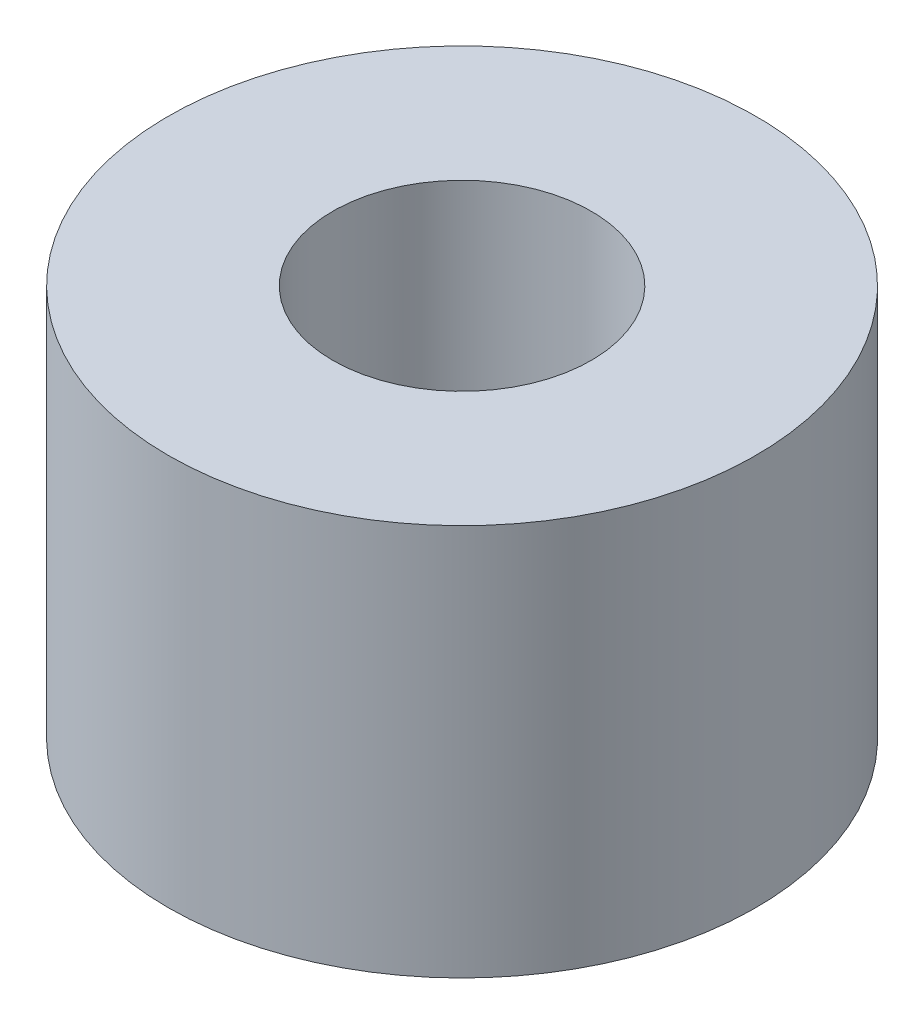
ISO-10303-21;
HEADER;
FILE_DESCRIPTION(('STEP AP214'),'2;1');
FILE_NAME('part.step','',(''),(''),'','','');
FILE_SCHEMA(('AUTOMOTIVE_DESIGN { 1 0 10303 214 1 1 1 1 }'));
ENDSEC;
DATA;
#1=APPLICATION_CONTEXT('core data for automotive mechanical design processes');
#2=APPLICATION_PROTOCOL_DEFINITION('international standard','automotive_design',2000,#1);
#3=PRODUCT_CONTEXT('',#1,'mechanical');
#4=PRODUCT('Part','Part','',(#3));
#5=PRODUCT_RELATED_PRODUCT_CATEGORY('part','',(#4));
#6=PRODUCT_DEFINITION_FORMATION('','',#4);
#7=PRODUCT_DEFINITION_CONTEXT('part definition',#1,'design');
#8=PRODUCT_DEFINITION('design','',#6,#7);
#9=PRODUCT_DEFINITION_SHAPE('','',#8);
#10=(LENGTH_UNIT() NAMED_UNIT(*) SI_UNIT(.MILLI.,.METRE.));
#11=(NAMED_UNIT(*) PLANE_ANGLE_UNIT() SI_UNIT($,.RADIAN.));
#12=(NAMED_UNIT(*) SI_UNIT($,.STERADIAN.) SOLID_ANGLE_UNIT());
#13=UNCERTAINTY_MEASURE_WITH_UNIT(LENGTH_MEASURE(1.E-05),#10,'distance_accuracy_value','');
#14=(GEOMETRIC_REPRESENTATION_CONTEXT(3) GLOBAL_UNCERTAINTY_ASSIGNED_CONTEXT((#13)) GLOBAL_UNIT_ASSIGNED_CONTEXT((#10,
#11,#12)) REPRESENTATION_CONTEXT('',''));
#15=CARTESIAN_POINT('',(0.,0.,0.));
#16=DIRECTION('',(0.,0.,1.));
#17=DIRECTION('',(1.,0.,0.));
#18=AXIS2_PLACEMENT_3D('',#15,#16,#17);
#19=CARTESIAN_POINT('',(0.,4.,0.));
#20=DIRECTION('',(0.,1.,0.));
#21=DIRECTION('',(0.,0.,1.));
#22=AXIS2_PLACEMENT_3D('',#19,#20,#21);
#23=PLANE('',#22);
#24=CARTESIAN_POINT('',(0.,4.,0.));
#25=DIRECTION('',(0.,1.,0.));
#26=DIRECTION('',(0.,0.,1.));
#27=AXIS2_PLACEMENT_3D('',#24,#25,#26);
#28=CIRCLE('',#27,3.);
#29=CARTESIAN_POINT('',(0.,4.,3.));
#30=VERTEX_POINT('',#29);
#31=EDGE_CURVE('E10',#30,#30,#28,.T.);
#32=ORIENTED_EDGE('',*,*,#31,.T.);
#33=EDGE_LOOP('',(#32));
#34=FACE_BOUND('',#33,.T.);
#35=CARTESIAN_POINT('',(0.,4.,0.));
#36=DIRECTION('',(0.,1.,0.));
#37=DIRECTION('',(0.,0.,1.));
#38=AXIS2_PLACEMENT_3D('',#35,#36,#37);
#39=CIRCLE('',#38,1.32);
#40=CARTESIAN_POINT('',(0.,4.,1.32));
#41=VERTEX_POINT('',#40);
#42=EDGE_CURVE('E43',#41,#41,#39,.T.);
#43=ORIENTED_EDGE('',*,*,#42,.F.);
#44=EDGE_LOOP('',(#43));
#45=FACE_BOUND('',#44,.T.);
#46=ADVANCED_FACE('F32',(#34,#45),#23,.T.);
#47=CARTESIAN_POINT('',(0.,0.,0.));
#48=DIRECTION('',(0.,1.,0.));
#49=DIRECTION('',(0.,0.,1.));
#50=AXIS2_PLACEMENT_3D('',#47,#48,#49);
#51=PLANE('',#50);
#52=CARTESIAN_POINT('',(0.,0.,0.));
#53=DIRECTION('',(0.,1.,0.));
#54=DIRECTION('',(0.,0.,1.));
#55=AXIS2_PLACEMENT_3D('',#52,#53,#54);
#56=CIRCLE('',#55,3.);
#57=CARTESIAN_POINT('',(0.,0.,3.));
#58=VERTEX_POINT('',#57);
#59=EDGE_CURVE('E36',#58,#58,#56,.T.);
#60=ORIENTED_EDGE('',*,*,#59,.F.);
#61=EDGE_LOOP('',(#60));
#62=FACE_BOUND('',#61,.T.);
#63=CARTESIAN_POINT('',(0.,0.,0.));
#64=DIRECTION('',(0.,1.,0.));
#65=DIRECTION('',(0.,0.,1.));
#66=AXIS2_PLACEMENT_3D('',#63,#64,#65);
#67=CIRCLE('',#66,1.32);
#68=CARTESIAN_POINT('',(0.,0.,1.32));
#69=VERTEX_POINT('',#68);
#70=EDGE_CURVE('E45',#69,#69,#67,.T.);
#71=ORIENTED_EDGE('',*,*,#70,.T.);
#72=EDGE_LOOP('',(#71));
#73=FACE_BOUND('',#72,.T.);
#74=ADVANCED_FACE('F55',(#62,#73),#51,.F.);
#75=CARTESIAN_POINT('',(0.,4.,0.));
#76=DIRECTION('',(0.,-1.,0.));
#77=DIRECTION('',(0.,0.,-1.));
#78=AXIS2_PLACEMENT_3D('',#75,#76,#77);
#79=CYLINDRICAL_SURFACE('',#78,3.);
#80=ORIENTED_EDGE('',*,*,#31,.F.);
#81=EDGE_LOOP('',(#80));
#82=FACE_BOUND('',#81,.T.);
#83=ORIENTED_EDGE('',*,*,#59,.T.);
#84=EDGE_LOOP('',(#83));
#85=FACE_BOUND('',#84,.T.);
#86=ADVANCED_FACE('F34',(#82,#85),#79,.T.);
#87=CARTESIAN_POINT('',(0.,4.,0.));
#88=DIRECTION('',(0.,-1.,0.));
#89=DIRECTION('',(0.,0.,-1.));
#90=AXIS2_PLACEMENT_3D('',#87,#88,#89);
#91=CYLINDRICAL_SURFACE('',#90,1.32);
#92=ORIENTED_EDGE('',*,*,#42,.T.);
#93=EDGE_LOOP('',(#92));
#94=FACE_BOUND('',#93,.T.);
#95=ORIENTED_EDGE('',*,*,#70,.F.);
#96=EDGE_LOOP('',(#95));
#97=FACE_BOUND('',#96,.T.);
#98=ADVANCED_FACE('F51',(#94,#97),#91,.F.);
#99=CLOSED_SHELL('',(#46,#74,#86,#98));
#100=MANIFOLD_SOLID_BREP('B2',#99);
#101=ADVANCED_BREP_SHAPE_REPRESENTATION('',(#18,#100),#14);
#102=SHAPE_DEFINITION_REPRESENTATION(#9,#101);
ENDSEC;
END-ISO-10303-21;
